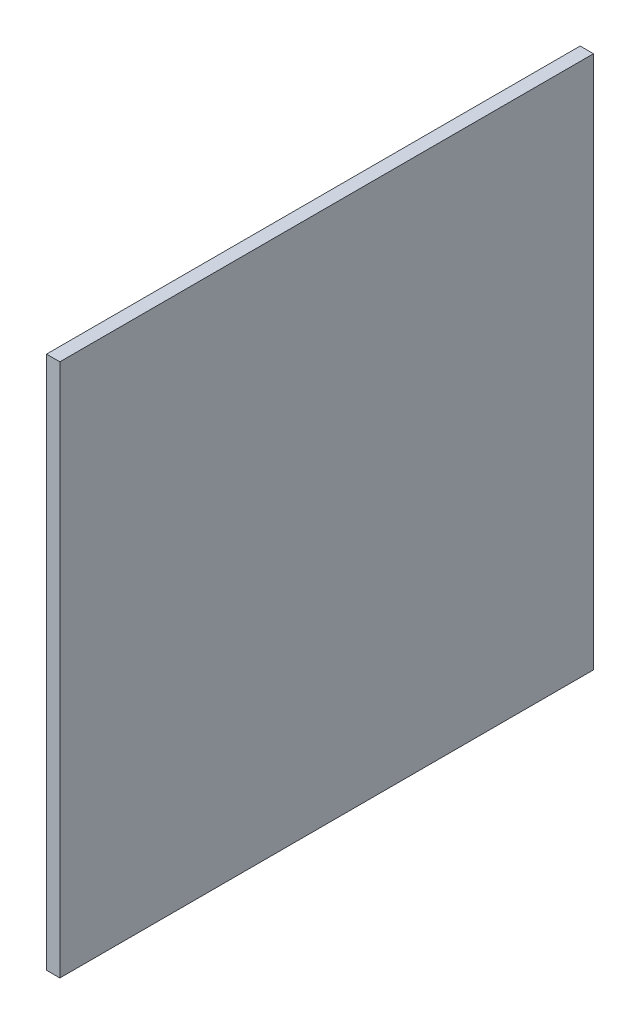
ISO-10303-21;
HEADER;
FILE_DESCRIPTION(('STEP AP214'),'2;1');
FILE_NAME('part.step','',(''),(''),'','','');
FILE_SCHEMA(('AUTOMOTIVE_DESIGN { 1 0 10303 214 1 1 1 1 }'));
ENDSEC;
DATA;
#1=APPLICATION_CONTEXT('core data for automotive mechanical design processes');
#2=APPLICATION_PROTOCOL_DEFINITION('international standard','automotive_design',2000,#1);
#3=PRODUCT_CONTEXT('',#1,'mechanical');
#4=PRODUCT('Part','Part','',(#3));
#5=PRODUCT_RELATED_PRODUCT_CATEGORY('part','',(#4));
#6=PRODUCT_DEFINITION_FORMATION('','',#4);
#7=PRODUCT_DEFINITION_CONTEXT('part definition',#1,'design');
#8=PRODUCT_DEFINITION('design','',#6,#7);
#9=PRODUCT_DEFINITION_SHAPE('','',#8);
#10=(LENGTH_UNIT() NAMED_UNIT(*) SI_UNIT(.MILLI.,.METRE.));
#11=(NAMED_UNIT(*) PLANE_ANGLE_UNIT() SI_UNIT($,.RADIAN.));
#12=(NAMED_UNIT(*) SI_UNIT($,.STERADIAN.) SOLID_ANGLE_UNIT());
#13=UNCERTAINTY_MEASURE_WITH_UNIT(LENGTH_MEASURE(1.E-05),#10,'distance_accuracy_value','');
#14=(GEOMETRIC_REPRESENTATION_CONTEXT(3) GLOBAL_UNCERTAINTY_ASSIGNED_CONTEXT((#13)) GLOBAL_UNIT_ASSIGNED_CONTEXT((#10,
#11,#12)) REPRESENTATION_CONTEXT('',''));
#15=CARTESIAN_POINT('',(0.,0.,0.));
#16=DIRECTION('',(0.,0.,1.));
#17=DIRECTION('',(1.,0.,0.));
#18=AXIS2_PLACEMENT_3D('',#15,#16,#17);
#19=CARTESIAN_POINT('',(10.,-200.,-200.));
#20=DIRECTION('',(0.,0.,1.));
#21=DIRECTION('',(1.,0.,0.));
#22=AXIS2_PLACEMENT_3D('',#19,#20,#21);
#23=PLANE('',#22);
#24=DIRECTION('',(0.,1.,0.));
#25=VECTOR('',#24,1.);
#26=CARTESIAN_POINT('',(0.,-200.,-200.));
#27=LINE('',#26,#25);
#28=CARTESIAN_POINT('',(0.,-200.,-200.));
#29=VERTEX_POINT('',#28);
#30=CARTESIAN_POINT('',(0.,200.,-200.));
#31=VERTEX_POINT('',#30);
#32=EDGE_CURVE('E107',#29,#31,#27,.T.);
#33=ORIENTED_EDGE('',*,*,#32,.T.);
#34=DIRECTION('',(-1.,0.,0.));
#35=VECTOR('',#34,1.);
#36=CARTESIAN_POINT('',(10.,200.,-200.));
#37=LINE('',#36,#35);
#38=CARTESIAN_POINT('',(10.,200.,-200.));
#39=VERTEX_POINT('',#38);
#40=EDGE_CURVE('E11',#39,#31,#37,.T.);
#41=ORIENTED_EDGE('',*,*,#40,.F.);
#42=DIRECTION('',(0.,1.,0.));
#43=VECTOR('',#42,1.);
#44=CARTESIAN_POINT('',(10.,-200.,-200.));
#45=LINE('',#44,#43);
#46=CARTESIAN_POINT('',(10.,-200.,-200.));
#47=VERTEX_POINT('',#46);
#48=EDGE_CURVE('E91',#47,#39,#45,.T.);
#49=ORIENTED_EDGE('',*,*,#48,.F.);
#50=DIRECTION('',(-1.,0.,0.));
#51=VECTOR('',#50,1.);
#52=CARTESIAN_POINT('',(10.,-200.,-200.));
#53=LINE('',#52,#51);
#54=EDGE_CURVE('E103',#47,#29,#53,.T.);
#55=ORIENTED_EDGE('',*,*,#54,.T.);
#56=EDGE_LOOP('',(#33,#41,#49,#55));
#57=FACE_BOUND('',#56,.T.);
#58=ADVANCED_FACE('F39',(#57),#23,.F.);
#59=CARTESIAN_POINT('',(10.,200.,200.));
#60=DIRECTION('',(0.,-1.,0.));
#61=DIRECTION('',(0.,0.,-1.));
#62=AXIS2_PLACEMENT_3D('',#59,#60,#61);
#63=PLANE('',#62);
#64=DIRECTION('',(0.,0.,1.));
#65=VECTOR('',#64,1.);
#66=CARTESIAN_POINT('',(0.,200.,200.));
#67=LINE('',#66,#65);
#68=CARTESIAN_POINT('',(0.,200.,200.));
#69=VERTEX_POINT('',#68);
#70=EDGE_CURVE('E96',#31,#69,#67,.T.);
#71=ORIENTED_EDGE('',*,*,#70,.T.);
#72=DIRECTION('',(-1.,0.,0.));
#73=VECTOR('',#72,1.);
#74=CARTESIAN_POINT('',(10.,200.,200.));
#75=LINE('',#74,#73);
#76=CARTESIAN_POINT('',(10.,200.,200.));
#77=VERTEX_POINT('',#76);
#78=EDGE_CURVE('E48',#77,#69,#75,.T.);
#79=ORIENTED_EDGE('',*,*,#78,.F.);
#80=DIRECTION('',(0.,0.,1.));
#81=VECTOR('',#80,1.);
#82=CARTESIAN_POINT('',(10.,200.,200.));
#83=LINE('',#82,#81);
#84=EDGE_CURVE('E86',#39,#77,#83,.T.);
#85=ORIENTED_EDGE('',*,*,#84,.F.);
#86=ORIENTED_EDGE('',*,*,#40,.T.);
#87=EDGE_LOOP('',(#71,#79,#85,#86));
#88=FACE_BOUND('',#87,.T.);
#89=ADVANCED_FACE('F95',(#88),#63,.F.);
#90=CARTESIAN_POINT('',(10.,-200.,200.));
#91=DIRECTION('',(0.,0.,-1.));
#92=DIRECTION('',(-1.,0.,0.));
#93=AXIS2_PLACEMENT_3D('',#90,#91,#92);
#94=PLANE('',#93);
#95=DIRECTION('',(0.,-1.,0.));
#96=VECTOR('',#95,1.);
#97=CARTESIAN_POINT('',(0.,-200.,200.));
#98=LINE('',#97,#96);
#99=CARTESIAN_POINT('',(0.,-200.,200.));
#100=VERTEX_POINT('',#99);
#101=EDGE_CURVE('E73',#69,#100,#98,.T.);
#102=ORIENTED_EDGE('',*,*,#101,.T.);
#103=DIRECTION('',(-1.,0.,0.));
#104=VECTOR('',#103,1.);
#105=CARTESIAN_POINT('',(10.,-200.,200.));
#106=LINE('',#105,#104);
#107=CARTESIAN_POINT('',(10.,-200.,200.));
#108=VERTEX_POINT('',#107);
#109=EDGE_CURVE('E98',#108,#100,#106,.T.);
#110=ORIENTED_EDGE('',*,*,#109,.F.);
#111=DIRECTION('',(0.,-1.,0.));
#112=VECTOR('',#111,1.);
#113=CARTESIAN_POINT('',(10.,-200.,200.));
#114=LINE('',#113,#112);
#115=EDGE_CURVE('E89',#77,#108,#114,.T.);
#116=ORIENTED_EDGE('',*,*,#115,.F.);
#117=ORIENTED_EDGE('',*,*,#78,.T.);
#118=EDGE_LOOP('',(#102,#110,#116,#117));
#119=FACE_BOUND('',#118,.T.);
#120=ADVANCED_FACE('F99',(#119),#94,.F.);
#121=CARTESIAN_POINT('',(10.,-200.,200.));
#122=DIRECTION('',(0.,1.,0.));
#123=DIRECTION('',(0.,0.,1.));
#124=AXIS2_PLACEMENT_3D('',#121,#122,#123);
#125=PLANE('',#124);
#126=DIRECTION('',(0.,0.,-1.));
#127=VECTOR('',#126,1.);
#128=CARTESIAN_POINT('',(0.,-200.,200.));
#129=LINE('',#128,#127);
#130=EDGE_CURVE('E79',#100,#29,#129,.T.);
#131=ORIENTED_EDGE('',*,*,#130,.T.);
#132=ORIENTED_EDGE('',*,*,#54,.F.);
#133=DIRECTION('',(0.,0.,-1.));
#134=VECTOR('',#133,1.);
#135=CARTESIAN_POINT('',(10.,-200.,200.));
#136=LINE('',#135,#134);
#137=EDGE_CURVE('E56',#108,#47,#136,.T.);
#138=ORIENTED_EDGE('',*,*,#137,.F.);
#139=ORIENTED_EDGE('',*,*,#109,.T.);
#140=EDGE_LOOP('',(#131,#132,#138,#139));
#141=FACE_BOUND('',#140,.T.);
#142=ADVANCED_FACE('F120',(#141),#125,.F.);
#143=CARTESIAN_POINT('',(10.,0.,0.));
#144=DIRECTION('',(-1.,0.,0.));
#145=DIRECTION('',(0.,0.,1.));
#146=AXIS2_PLACEMENT_3D('',#143,#144,#145);
#147=PLANE('',#146);
#148=ORIENTED_EDGE('',*,*,#48,.T.);
#149=ORIENTED_EDGE('',*,*,#84,.T.);
#150=ORIENTED_EDGE('',*,*,#115,.T.);
#151=ORIENTED_EDGE('',*,*,#137,.T.);
#152=EDGE_LOOP('',(#148,#149,#150,#151));
#153=FACE_BOUND('',#152,.T.);
#154=ADVANCED_FACE('F87',(#153),#147,.F.);
#155=CARTESIAN_POINT('',(0.,0.,0.));
#156=DIRECTION('',(-1.,0.,0.));
#157=DIRECTION('',(0.,0.,1.));
#158=AXIS2_PLACEMENT_3D('',#155,#156,#157);
#159=PLANE('',#158);
#160=ORIENTED_EDGE('',*,*,#32,.F.);
#161=ORIENTED_EDGE('',*,*,#130,.F.);
#162=ORIENTED_EDGE('',*,*,#101,.F.);
#163=ORIENTED_EDGE('',*,*,#70,.F.);
#164=EDGE_LOOP('',(#160,#161,#162,#163));
#165=FACE_BOUND('',#164,.T.);
#166=ADVANCED_FACE('F123',(#165),#159,.T.);
#167=CLOSED_SHELL('',(#58,#89,#120,#142,#154,#166));
#168=MANIFOLD_SOLID_BREP('B2',#167);
#169=ADVANCED_BREP_SHAPE_REPRESENTATION('',(#18,#168),#14);
#170=SHAPE_DEFINITION_REPRESENTATION(#9,#169);
ENDSEC;
END-ISO-10303-21;
